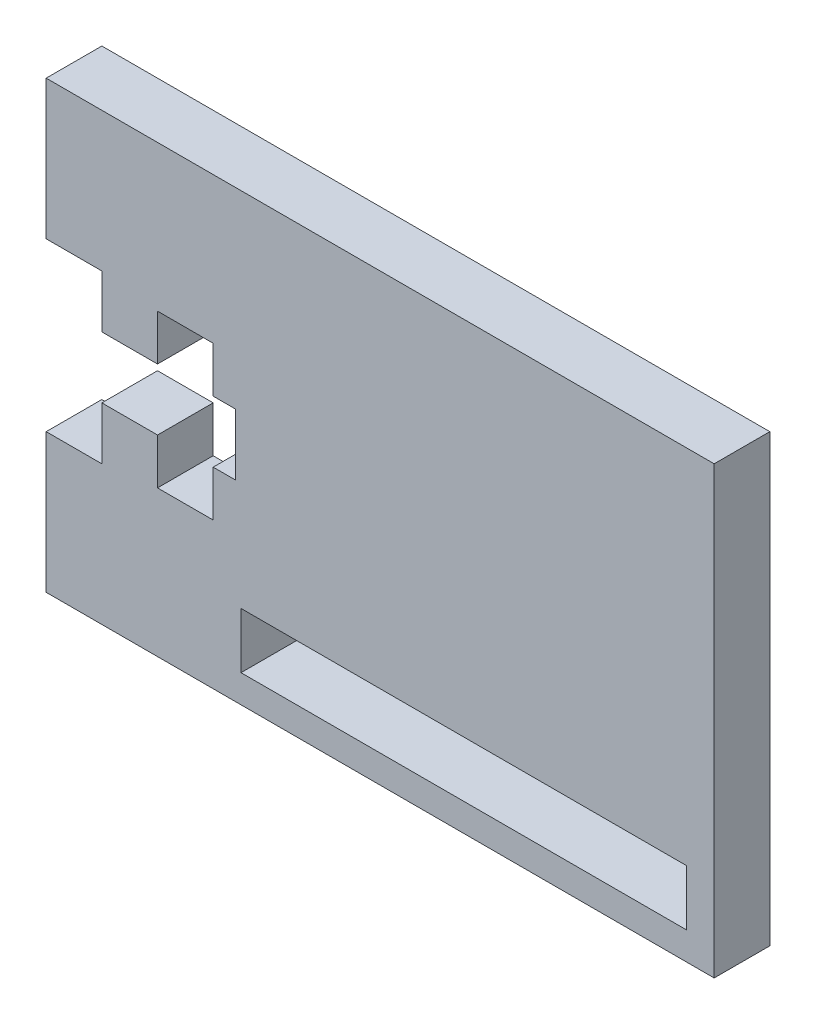
ISO-10303-21;
HEADER;
FILE_DESCRIPTION(('STEP AP214'),'2;1');
FILE_NAME('part.step','',(''),(''),'','','');
FILE_SCHEMA(('AUTOMOTIVE_DESIGN { 1 0 10303 214 1 1 1 1 }'));
ENDSEC;
DATA;
#1=APPLICATION_CONTEXT('core data for automotive mechanical design processes');
#2=APPLICATION_PROTOCOL_DEFINITION('international standard','automotive_design',2000,#1);
#3=PRODUCT_CONTEXT('',#1,'mechanical');
#4=PRODUCT('Part','Part','',(#3));
#5=PRODUCT_RELATED_PRODUCT_CATEGORY('part','',(#4));
#6=PRODUCT_DEFINITION_FORMATION('','',#4);
#7=PRODUCT_DEFINITION_CONTEXT('part definition',#1,'design');
#8=PRODUCT_DEFINITION('design','',#6,#7);
#9=PRODUCT_DEFINITION_SHAPE('','',#8);
#10=(LENGTH_UNIT() NAMED_UNIT(*) SI_UNIT(.MILLI.,.METRE.));
#11=(NAMED_UNIT(*) PLANE_ANGLE_UNIT() SI_UNIT($,.RADIAN.));
#12=(NAMED_UNIT(*) SI_UNIT($,.STERADIAN.) SOLID_ANGLE_UNIT());
#13=UNCERTAINTY_MEASURE_WITH_UNIT(LENGTH_MEASURE(1.E-05),#10,'distance_accuracy_value','');
#14=(GEOMETRIC_REPRESENTATION_CONTEXT(3) GLOBAL_UNCERTAINTY_ASSIGNED_CONTEXT((#13)) GLOBAL_UNIT_ASSIGNED_CONTEXT((#10,
#11,#12)) REPRESENTATION_CONTEXT('',''));
#15=CARTESIAN_POINT('',(0.,0.,0.));
#16=DIRECTION('',(0.,0.,1.));
#17=DIRECTION('',(1.,0.,0.));
#18=AXIS2_PLACEMENT_3D('',#15,#16,#17);
#19=CARTESIAN_POINT('',(0.,4.7625,3.175));
#20=DIRECTION('',(0.,1.,0.));
#21=DIRECTION('',(0.,0.,1.));
#22=AXIS2_PLACEMENT_3D('',#19,#20,#21);
#23=PLANE('',#22);
#24=DIRECTION('',(1.,0.,0.));
#25=VECTOR('',#24,1.);
#26=CARTESIAN_POINT('',(0.,4.7625,0.));
#27=LINE('',#26,#25);
#28=CARTESIAN_POINT('',(11.1125,4.7625,0.));
#29=VERTEX_POINT('',#28);
#30=CARTESIAN_POINT('',(36.5125,4.7625,0.));
#31=VERTEX_POINT('',#30);
#32=EDGE_CURVE('E274',#29,#31,#27,.T.);
#33=ORIENTED_EDGE('',*,*,#32,.T.);
#34=DIRECTION('',(0.,0.,-1.));
#35=VECTOR('',#34,1.);
#36=CARTESIAN_POINT('',(36.5125,4.7625,3.175));
#37=LINE('',#36,#35);
#38=CARTESIAN_POINT('',(36.5125,4.7625,3.175));
#39=VERTEX_POINT('',#38);
#40=EDGE_CURVE('E11',#39,#31,#37,.T.);
#41=ORIENTED_EDGE('',*,*,#40,.F.);
#42=DIRECTION('',(1.,0.,0.));
#43=VECTOR('',#42,1.);
#44=CARTESIAN_POINT('',(0.,4.7625,3.175));
#45=LINE('',#44,#43);
#46=CARTESIAN_POINT('',(11.1125,4.7625,3.175));
#47=VERTEX_POINT('',#46);
#48=EDGE_CURVE('E211',#47,#39,#45,.T.);
#49=ORIENTED_EDGE('',*,*,#48,.F.);
#50=DIRECTION('',(0.,0.,-1.));
#51=VECTOR('',#50,1.);
#52=CARTESIAN_POINT('',(11.1125,4.7625,3.175));
#53=LINE('',#52,#51);
#54=EDGE_CURVE('E54',#47,#29,#53,.T.);
#55=ORIENTED_EDGE('',*,*,#54,.T.);
#56=EDGE_LOOP('',(#33,#41,#49,#55));
#57=FACE_BOUND('',#56,.T.);
#58=ADVANCED_FACE('F35',(#57),#23,.F.);
#59=CARTESIAN_POINT('',(36.5125,0.,3.175));
#60=DIRECTION('',(1.,0.,0.));
#61=DIRECTION('',(0.,0.,-1.));
#62=AXIS2_PLACEMENT_3D('',#59,#60,#61);
#63=PLANE('',#62);
#64=DIRECTION('',(0.,-1.,0.));
#65=VECTOR('',#64,1.);
#66=CARTESIAN_POINT('',(36.5125,0.,0.));
#67=LINE('',#66,#65);
#68=CARTESIAN_POINT('',(36.5125,1.5875,0.));
#69=VERTEX_POINT('',#68);
#70=EDGE_CURVE('E217',#31,#69,#67,.T.);
#71=ORIENTED_EDGE('',*,*,#70,.T.);
#72=DIRECTION('',(0.,0.,-1.));
#73=VECTOR('',#72,1.);
#74=CARTESIAN_POINT('',(36.5125,1.5875,3.175));
#75=LINE('',#74,#73);
#76=CARTESIAN_POINT('',(36.5125,1.5875,3.175));
#77=VERTEX_POINT('',#76);
#78=EDGE_CURVE('E45',#77,#69,#75,.T.);
#79=ORIENTED_EDGE('',*,*,#78,.F.);
#80=DIRECTION('',(0.,-1.,0.));
#81=VECTOR('',#80,1.);
#82=CARTESIAN_POINT('',(36.5125,0.,3.175));
#83=LINE('',#82,#81);
#84=EDGE_CURVE('E205',#39,#77,#83,.T.);
#85=ORIENTED_EDGE('',*,*,#84,.F.);
#86=ORIENTED_EDGE('',*,*,#40,.T.);
#87=EDGE_LOOP('',(#71,#79,#85,#86));
#88=FACE_BOUND('',#87,.T.);
#89=ADVANCED_FACE('F216',(#88),#63,.F.);
#90=CARTESIAN_POINT('',(0.,1.5875,3.175));
#91=DIRECTION('',(0.,1.,0.));
#92=DIRECTION('',(0.,0.,1.));
#93=AXIS2_PLACEMENT_3D('',#90,#91,#92);
#94=PLANE('',#93);
#95=DIRECTION('',(1.,0.,0.));
#96=VECTOR('',#95,1.);
#97=CARTESIAN_POINT('',(0.,1.5875,0.));
#98=LINE('',#97,#96);
#99=CARTESIAN_POINT('',(11.1125,1.5875,0.));
#100=VERTEX_POINT('',#99);
#101=EDGE_CURVE('E277',#100,#69,#98,.T.);
#102=ORIENTED_EDGE('',*,*,#101,.F.);
#103=DIRECTION('',(0.,0.,-1.));
#104=VECTOR('',#103,1.);
#105=CARTESIAN_POINT('',(11.1125,1.5875,3.175));
#106=LINE('',#105,#104);
#107=CARTESIAN_POINT('',(11.1125,1.5875,3.175));
#108=VERTEX_POINT('',#107);
#109=EDGE_CURVE('E128',#108,#100,#106,.T.);
#110=ORIENTED_EDGE('',*,*,#109,.F.);
#111=DIRECTION('',(1.,0.,0.));
#112=VECTOR('',#111,1.);
#113=CARTESIAN_POINT('',(0.,1.5875,3.175));
#114=LINE('',#113,#112);
#115=EDGE_CURVE('E210',#108,#77,#114,.T.);
#116=ORIENTED_EDGE('',*,*,#115,.T.);
#117=ORIENTED_EDGE('',*,*,#78,.T.);
#118=EDGE_LOOP('',(#102,#110,#116,#117));
#119=FACE_BOUND('',#118,.T.);
#120=ADVANCED_FACE('F221',(#119),#94,.T.);
#121=CARTESIAN_POINT('',(3.175,0.,3.175));
#122=DIRECTION('',(1.,0.,0.));
#123=DIRECTION('',(0.,0.,-1.));
#124=AXIS2_PLACEMENT_3D('',#121,#122,#123);
#125=PLANE('',#124);
#126=DIRECTION('',(0.,-1.,0.));
#127=VECTOR('',#126,1.);
#128=CARTESIAN_POINT('',(3.175,0.,0.));
#129=LINE('',#128,#127);
#130=CARTESIAN_POINT('',(3.175,10.9474,0.));
#131=VERTEX_POINT('',#130);
#132=CARTESIAN_POINT('',(3.175,7.9375,0.));
#133=VERTEX_POINT('',#132);
#134=EDGE_CURVE('E228',#131,#133,#129,.T.);
#135=ORIENTED_EDGE('',*,*,#134,.T.);
#136=DIRECTION('',(0.,0.,-1.));
#137=VECTOR('',#136,1.);
#138=CARTESIAN_POINT('',(3.175,7.9375,3.175));
#139=LINE('',#138,#137);
#140=CARTESIAN_POINT('',(3.175,7.9375,3.175));
#141=VERTEX_POINT('',#140);
#142=EDGE_CURVE('E39',#141,#133,#139,.T.);
#143=ORIENTED_EDGE('',*,*,#142,.F.);
#144=DIRECTION('',(0.,-1.,0.));
#145=VECTOR('',#144,1.);
#146=CARTESIAN_POINT('',(3.175,0.,3.175));
#147=LINE('',#146,#145);
#148=CARTESIAN_POINT('',(3.175,10.9474,3.175));
#149=VERTEX_POINT('',#148);
#150=EDGE_CURVE('E282',#149,#141,#147,.T.);
#151=ORIENTED_EDGE('',*,*,#150,.F.);
#152=DIRECTION('',(0.,0.,-1.));
#153=VECTOR('',#152,1.);
#154=CARTESIAN_POINT('',(3.175,10.9474,3.175));
#155=LINE('',#154,#153);
#156=EDGE_CURVE('E224',#149,#131,#155,.T.);
#157=ORIENTED_EDGE('',*,*,#156,.T.);
#158=EDGE_LOOP('',(#135,#143,#151,#157));
#159=FACE_BOUND('',#158,.T.);
#160=ADVANCED_FACE('F37',(#159),#125,.F.);
#161=CARTESIAN_POINT('',(0.,7.9375,3.175));
#162=DIRECTION('',(0.,-1.,0.));
#163=DIRECTION('',(0.,0.,-1.));
#164=AXIS2_PLACEMENT_3D('',#161,#162,#163);
#165=PLANE('',#164);
#166=DIRECTION('',(-1.,0.,0.));
#167=VECTOR('',#166,1.);
#168=CARTESIAN_POINT('',(0.,7.9375,0.));
#169=LINE('',#168,#167);
#170=CARTESIAN_POINT('',(0.,7.9375,0.));
#171=VERTEX_POINT('',#170);
#172=EDGE_CURVE('E231',#133,#171,#169,.T.);
#173=ORIENTED_EDGE('',*,*,#172,.T.);
#174=DIRECTION('',(0.,0.,-1.));
#175=VECTOR('',#174,1.);
#176=CARTESIAN_POINT('',(0.,7.9375,3.175));
#177=LINE('',#176,#175);
#178=CARTESIAN_POINT('',(0.,7.9375,3.175));
#179=VERTEX_POINT('',#178);
#180=EDGE_CURVE('E331',#179,#171,#177,.T.);
#181=ORIENTED_EDGE('',*,*,#180,.F.);
#182=DIRECTION('',(-1.,0.,0.));
#183=VECTOR('',#182,1.);
#184=CARTESIAN_POINT('',(0.,7.9375,3.175));
#185=LINE('',#184,#183);
#186=EDGE_CURVE('E141',#141,#179,#185,.T.);
#187=ORIENTED_EDGE('',*,*,#186,.F.);
#188=ORIENTED_EDGE('',*,*,#142,.T.);
#189=EDGE_LOOP('',(#173,#181,#187,#188));
#190=FACE_BOUND('',#189,.T.);
#191=ADVANCED_FACE('F336',(#190),#165,.F.);
#192=CARTESIAN_POINT('',(0.,0.,3.175));
#193=DIRECTION('',(-1.,0.,0.));
#194=DIRECTION('',(0.,0.,1.));
#195=AXIS2_PLACEMENT_3D('',#192,#193,#194);
#196=PLANE('',#195);
#197=DIRECTION('',(0.,1.,0.));
#198=VECTOR('',#197,1.);
#199=CARTESIAN_POINT('',(0.,0.,0.));
#200=LINE('',#199,#198);
#201=CARTESIAN_POINT('',(0.,0.,0.));
#202=VERTEX_POINT('',#201);
#203=EDGE_CURVE('E234',#202,#171,#200,.T.);
#204=ORIENTED_EDGE('',*,*,#203,.F.);
#205=DIRECTION('',(0.,0.,-1.));
#206=VECTOR('',#205,1.);
#207=CARTESIAN_POINT('',(0.,0.,3.175));
#208=LINE('',#207,#206);
#209=CARTESIAN_POINT('',(0.,0.,3.175));
#210=VERTEX_POINT('',#209);
#211=EDGE_CURVE('E330',#210,#202,#208,.T.);
#212=ORIENTED_EDGE('',*,*,#211,.F.);
#213=DIRECTION('',(0.,1.,0.));
#214=VECTOR('',#213,1.);
#215=CARTESIAN_POINT('',(0.,0.,3.175));
#216=LINE('',#215,#214);
#217=EDGE_CURVE('E351',#210,#179,#216,.T.);
#218=ORIENTED_EDGE('',*,*,#217,.T.);
#219=ORIENTED_EDGE('',*,*,#180,.T.);
#220=EDGE_LOOP('',(#204,#212,#218,#219));
#221=FACE_BOUND('',#220,.T.);
#222=ADVANCED_FACE('F348',(#221),#196,.T.);
#223=CARTESIAN_POINT('',(0.,0.,3.175));
#224=DIRECTION('',(0.,1.,0.));
#225=DIRECTION('',(0.,0.,1.));
#226=AXIS2_PLACEMENT_3D('',#223,#224,#225);
#227=PLANE('',#226);
#228=DIRECTION('',(1.,0.,0.));
#229=VECTOR('',#228,1.);
#230=CARTESIAN_POINT('',(0.,0.,0.));
#231=LINE('',#230,#229);
#232=CARTESIAN_POINT('',(38.1,0.,0.));
#233=VERTEX_POINT('',#232);
#234=EDGE_CURVE('E237',#202,#233,#231,.T.);
#235=ORIENTED_EDGE('',*,*,#234,.T.);
#236=DIRECTION('',(0.,0.,-1.));
#237=VECTOR('',#236,1.);
#238=CARTESIAN_POINT('',(38.1,0.,3.175));
#239=LINE('',#238,#237);
#240=CARTESIAN_POINT('',(38.1,0.,3.175));
#241=VERTEX_POINT('',#240);
#242=EDGE_CURVE('E327',#241,#233,#239,.T.);
#243=ORIENTED_EDGE('',*,*,#242,.F.);
#244=DIRECTION('',(1.,0.,0.));
#245=VECTOR('',#244,1.);
#246=CARTESIAN_POINT('',(0.,0.,3.175));
#247=LINE('',#246,#245);
#248=EDGE_CURVE('E354',#210,#241,#247,.T.);
#249=ORIENTED_EDGE('',*,*,#248,.F.);
#250=ORIENTED_EDGE('',*,*,#211,.T.);
#251=EDGE_LOOP('',(#235,#243,#249,#250));
#252=FACE_BOUND('',#251,.T.);
#253=ADVANCED_FACE('F355',(#252),#227,.F.);
#254=CARTESIAN_POINT('',(38.1,0.,3.175));
#255=DIRECTION('',(-1.,0.,0.));
#256=DIRECTION('',(0.,0.,1.));
#257=AXIS2_PLACEMENT_3D('',#254,#255,#256);
#258=PLANE('',#257);
#259=DIRECTION('',(0.,1.,0.));
#260=VECTOR('',#259,1.);
#261=CARTESIAN_POINT('',(38.1,0.,0.));
#262=LINE('',#261,#260);
#263=CARTESIAN_POINT('',(38.1,25.4,0.));
#264=VERTEX_POINT('',#263);
#265=EDGE_CURVE('E240',#233,#264,#262,.T.);
#266=ORIENTED_EDGE('',*,*,#265,.T.);
#267=DIRECTION('',(0.,0.,-1.));
#268=VECTOR('',#267,1.);
#269=CARTESIAN_POINT('',(38.1,25.4,3.175));
#270=LINE('',#269,#268);
#271=CARTESIAN_POINT('',(38.1,25.4,3.175));
#272=VERTEX_POINT('',#271);
#273=EDGE_CURVE('E325',#272,#264,#270,.T.);
#274=ORIENTED_EDGE('',*,*,#273,.F.);
#275=DIRECTION('',(0.,1.,0.));
#276=VECTOR('',#275,1.);
#277=CARTESIAN_POINT('',(38.1,0.,3.175));
#278=LINE('',#277,#276);
#279=EDGE_CURVE('E358',#241,#272,#278,.T.);
#280=ORIENTED_EDGE('',*,*,#279,.F.);
#281=ORIENTED_EDGE('',*,*,#242,.T.);
#282=EDGE_LOOP('',(#266,#274,#280,#281));
#283=FACE_BOUND('',#282,.T.);
#284=ADVANCED_FACE('F468',(#283),#258,.F.);
#285=CARTESIAN_POINT('',(0.,25.4,3.175));
#286=DIRECTION('',(0.,1.,0.));
#287=DIRECTION('',(0.,0.,1.));
#288=AXIS2_PLACEMENT_3D('',#285,#286,#287);
#289=PLANE('',#288);
#290=DIRECTION('',(1.,0.,0.));
#291=VECTOR('',#290,1.);
#292=CARTESIAN_POINT('',(0.,25.4,0.));
#293=LINE('',#292,#291);
#294=CARTESIAN_POINT('',(0.,25.4,0.));
#295=VERTEX_POINT('',#294);
#296=EDGE_CURVE('E243',#295,#264,#293,.T.);
#297=ORIENTED_EDGE('',*,*,#296,.F.);
#298=DIRECTION('',(0.,0.,-1.));
#299=VECTOR('',#298,1.);
#300=CARTESIAN_POINT('',(0.,25.4,3.175));
#301=LINE('',#300,#299);
#302=CARTESIAN_POINT('',(0.,25.4,3.175));
#303=VERTEX_POINT('',#302);
#304=EDGE_CURVE('E323',#303,#295,#301,.T.);
#305=ORIENTED_EDGE('',*,*,#304,.F.);
#306=DIRECTION('',(1.,0.,0.));
#307=VECTOR('',#306,1.);
#308=CARTESIAN_POINT('',(0.,25.4,3.175));
#309=LINE('',#308,#307);
#310=EDGE_CURVE('E365',#303,#272,#309,.T.);
#311=ORIENTED_EDGE('',*,*,#310,.T.);
#312=ORIENTED_EDGE('',*,*,#273,.T.);
#313=EDGE_LOOP('',(#297,#305,#311,#312));
#314=FACE_BOUND('',#313,.T.);
#315=ADVANCED_FACE('F465',(#314),#289,.T.);
#316=CARTESIAN_POINT('',(0.,17.4625,0.));
#317=VERTEX_POINT('',#316);
#318=EDGE_CURVE('E238',#317,#295,#200,.T.);
#319=ORIENTED_EDGE('',*,*,#318,.F.);
#320=DIRECTION('',(0.,0.,-1.));
#321=VECTOR('',#320,1.);
#322=CARTESIAN_POINT('',(0.,17.4625,3.175));
#323=LINE('',#322,#321);
#324=CARTESIAN_POINT('',(0.,17.4625,3.175));
#325=VERTEX_POINT('',#324);
#326=EDGE_CURVE('E321',#325,#317,#323,.T.);
#327=ORIENTED_EDGE('',*,*,#326,.F.);
#328=EDGE_CURVE('E361',#325,#303,#216,.T.);
#329=ORIENTED_EDGE('',*,*,#328,.T.);
#330=ORIENTED_EDGE('',*,*,#304,.T.);
#331=EDGE_LOOP('',(#319,#327,#329,#330));
#332=FACE_BOUND('',#331,.T.);
#333=ADVANCED_FACE('F464',(#332),#196,.T.);
#334=CARTESIAN_POINT('',(0.,17.4625,3.175));
#335=DIRECTION('',(0.,-1.,0.));
#336=DIRECTION('',(0.,0.,-1.));
#337=AXIS2_PLACEMENT_3D('',#334,#335,#336);
#338=PLANE('',#337);
#339=DIRECTION('',(-1.,0.,0.));
#340=VECTOR('',#339,1.);
#341=CARTESIAN_POINT('',(0.,17.4625,0.));
#342=LINE('',#341,#340);
#343=CARTESIAN_POINT('',(3.175,17.4625,0.));
#344=VERTEX_POINT('',#343);
#345=EDGE_CURVE('E246',#344,#317,#342,.T.);
#346=ORIENTED_EDGE('',*,*,#345,.F.);
#347=DIRECTION('',(0.,0.,-1.));
#348=VECTOR('',#347,1.);
#349=CARTESIAN_POINT('',(3.175,17.4625,3.175));
#350=LINE('',#349,#348);
#351=CARTESIAN_POINT('',(3.175,17.4625,3.175));
#352=VERTEX_POINT('',#351);
#353=EDGE_CURVE('E319',#352,#344,#350,.T.);
#354=ORIENTED_EDGE('',*,*,#353,.F.);
#355=DIRECTION('',(-1.,0.,0.));
#356=VECTOR('',#355,1.);
#357=CARTESIAN_POINT('',(0.,17.4625,3.175));
#358=LINE('',#357,#356);
#359=EDGE_CURVE('E364',#352,#325,#358,.T.);
#360=ORIENTED_EDGE('',*,*,#359,.T.);
#361=ORIENTED_EDGE('',*,*,#326,.T.);
#362=EDGE_LOOP('',(#346,#354,#360,#361));
#363=FACE_BOUND('',#362,.T.);
#364=ADVANCED_FACE('F460',(#363),#338,.T.);
#365=CARTESIAN_POINT('',(3.175,0.,3.175));
#366=DIRECTION('',(-1.,0.,0.));
#367=DIRECTION('',(0.,0.,1.));
#368=AXIS2_PLACEMENT_3D('',#365,#366,#367);
#369=PLANE('',#368);
#370=DIRECTION('',(0.,1.,0.));
#371=VECTOR('',#370,1.);
#372=CARTESIAN_POINT('',(3.175,0.,0.));
#373=LINE('',#372,#371);
#374=CARTESIAN_POINT('',(3.175,14.4526,0.));
#375=VERTEX_POINT('',#374);
#376=EDGE_CURVE('E249',#375,#344,#373,.T.);
#377=ORIENTED_EDGE('',*,*,#376,.F.);
#378=DIRECTION('',(0.,0.,-1.));
#379=VECTOR('',#378,1.);
#380=CARTESIAN_POINT('',(3.175,14.4526,3.175));
#381=LINE('',#380,#379);
#382=CARTESIAN_POINT('',(3.175,14.4526,3.175));
#383=VERTEX_POINT('',#382);
#384=EDGE_CURVE('E317',#383,#375,#381,.T.);
#385=ORIENTED_EDGE('',*,*,#384,.F.);
#386=DIRECTION('',(0.,1.,0.));
#387=VECTOR('',#386,1.);
#388=CARTESIAN_POINT('',(3.175,0.,3.175));
#389=LINE('',#388,#387);
#390=EDGE_CURVE('E369',#383,#352,#389,.T.);
#391=ORIENTED_EDGE('',*,*,#390,.T.);
#392=ORIENTED_EDGE('',*,*,#353,.T.);
#393=EDGE_LOOP('',(#377,#385,#391,#392));
#394=FACE_BOUND('',#393,.T.);
#395=ADVANCED_FACE('F456',(#394),#369,.T.);
#396=CARTESIAN_POINT('',(0.,14.4526,3.175));
#397=DIRECTION('',(0.,1.,0.));
#398=DIRECTION('',(0.,0.,1.));
#399=AXIS2_PLACEMENT_3D('',#396,#397,#398);
#400=PLANE('',#399);
#401=DIRECTION('',(1.,0.,0.));
#402=VECTOR('',#401,1.);
#403=CARTESIAN_POINT('',(0.,14.4526,0.));
#404=LINE('',#403,#402);
#405=CARTESIAN_POINT('',(6.35,14.4526,0.));
#406=VERTEX_POINT('',#405);
#407=EDGE_CURVE('E252',#375,#406,#404,.T.);
#408=ORIENTED_EDGE('',*,*,#407,.T.);
#409=DIRECTION('',(0.,0.,-1.));
#410=VECTOR('',#409,1.);
#411=CARTESIAN_POINT('',(6.35,14.4526,3.175));
#412=LINE('',#411,#410);
#413=CARTESIAN_POINT('',(6.35,14.4526,3.175));
#414=VERTEX_POINT('',#413);
#415=EDGE_CURVE('E314',#414,#406,#412,.T.);
#416=ORIENTED_EDGE('',*,*,#415,.F.);
#417=DIRECTION('',(1.,0.,0.));
#418=VECTOR('',#417,1.);
#419=CARTESIAN_POINT('',(0.,14.4526,3.175));
#420=LINE('',#419,#418);
#421=EDGE_CURVE('E379',#383,#414,#420,.T.);
#422=ORIENTED_EDGE('',*,*,#421,.F.);
#423=ORIENTED_EDGE('',*,*,#384,.T.);
#424=EDGE_LOOP('',(#408,#416,#422,#423));
#425=FACE_BOUND('',#424,.T.);
#426=ADVANCED_FACE('F452',(#425),#400,.F.);
#427=CARTESIAN_POINT('',(6.34999999999999,0.,3.175));
#428=DIRECTION('',(-1.,0.,0.));
#429=DIRECTION('',(0.,-1.,0.));
#430=AXIS2_PLACEMENT_3D('',#427,#428,#429);
#431=PLANE('',#430);
#432=DIRECTION('',(0.,1.,0.));
#433=VECTOR('',#432,1.);
#434=CARTESIAN_POINT('',(6.34999999999999,0.,0.));
#435=LINE('',#434,#433);
#436=CARTESIAN_POINT('',(6.35,17.065625,0.));
#437=VERTEX_POINT('',#436);
#438=EDGE_CURVE('E254',#406,#437,#435,.T.);
#439=ORIENTED_EDGE('',*,*,#438,.T.);
#440=DIRECTION('',(0.,0.,-1.));
#441=VECTOR('',#440,1.);
#442=CARTESIAN_POINT('',(6.35,17.065625,3.175));
#443=LINE('',#442,#441);
#444=CARTESIAN_POINT('',(6.35,17.065625,3.175));
#445=VERTEX_POINT('',#444);
#446=EDGE_CURVE('E311',#445,#437,#443,.T.);
#447=ORIENTED_EDGE('',*,*,#446,.F.);
#448=DIRECTION('',(0.,1.,0.));
#449=VECTOR('',#448,1.);
#450=CARTESIAN_POINT('',(6.34999999999999,0.,3.175));
#451=LINE('',#450,#449);
#452=EDGE_CURVE('E381',#414,#445,#451,.T.);
#453=ORIENTED_EDGE('',*,*,#452,.F.);
#454=ORIENTED_EDGE('',*,*,#415,.T.);
#455=EDGE_LOOP('',(#439,#447,#453,#454));
#456=FACE_BOUND('',#455,.T.);
#457=ADVANCED_FACE('F448',(#456),#431,.F.);
#458=CARTESIAN_POINT('',(0.,17.065625,3.175));
#459=DIRECTION('',(0.,1.,0.));
#460=DIRECTION('',(0.,0.,1.));
#461=AXIS2_PLACEMENT_3D('',#458,#459,#460);
#462=PLANE('',#461);
#463=DIRECTION('',(1.,0.,0.));
#464=VECTOR('',#463,1.);
#465=CARTESIAN_POINT('',(0.,17.065625,0.));
#466=LINE('',#465,#464);
#467=CARTESIAN_POINT('',(9.525,17.065625,0.));
#468=VERTEX_POINT('',#467);
#469=EDGE_CURVE('E256',#437,#468,#466,.T.);
#470=ORIENTED_EDGE('',*,*,#469,.T.);
#471=DIRECTION('',(0.,0.,-1.));
#472=VECTOR('',#471,1.);
#473=CARTESIAN_POINT('',(9.525,17.065625,3.175));
#474=LINE('',#473,#472);
#475=CARTESIAN_POINT('',(9.525,17.065625,3.175));
#476=VERTEX_POINT('',#475);
#477=EDGE_CURVE('E308',#476,#468,#474,.T.);
#478=ORIENTED_EDGE('',*,*,#477,.F.);
#479=DIRECTION('',(1.,0.,0.));
#480=VECTOR('',#479,1.);
#481=CARTESIAN_POINT('',(0.,17.065625,3.175));
#482=LINE('',#481,#480);
#483=EDGE_CURVE('E383',#445,#476,#482,.T.);
#484=ORIENTED_EDGE('',*,*,#483,.F.);
#485=ORIENTED_EDGE('',*,*,#446,.T.);
#486=EDGE_LOOP('',(#470,#478,#484,#485));
#487=FACE_BOUND('',#486,.T.);
#488=ADVANCED_FACE('F443',(#487),#462,.F.);
#489=CARTESIAN_POINT('',(9.52500000000001,0.,3.175));
#490=DIRECTION('',(1.,0.,0.));
#491=DIRECTION('',(0.,1.,0.));
#492=AXIS2_PLACEMENT_3D('',#489,#490,#491);
#493=PLANE('',#492);
#494=DIRECTION('',(0.,-1.,0.));
#495=VECTOR('',#494,1.);
#496=CARTESIAN_POINT('',(9.52500000000001,0.,0.));
#497=LINE('',#496,#495);
#498=CARTESIAN_POINT('',(9.525,14.4526,0.));
#499=VERTEX_POINT('',#498);
#500=EDGE_CURVE('E258',#468,#499,#497,.T.);
#501=ORIENTED_EDGE('',*,*,#500,.T.);
#502=DIRECTION('',(0.,0.,-1.));
#503=VECTOR('',#502,1.);
#504=CARTESIAN_POINT('',(9.525,14.4526,3.175));
#505=LINE('',#504,#503);
#506=CARTESIAN_POINT('',(9.525,14.4526,3.175));
#507=VERTEX_POINT('',#506);
#508=EDGE_CURVE('E305',#507,#499,#505,.T.);
#509=ORIENTED_EDGE('',*,*,#508,.F.);
#510=DIRECTION('',(0.,-1.,0.));
#511=VECTOR('',#510,1.);
#512=CARTESIAN_POINT('',(9.52500000000001,0.,3.175));
#513=LINE('',#512,#511);
#514=EDGE_CURVE('E385',#476,#507,#513,.T.);
#515=ORIENTED_EDGE('',*,*,#514,.F.);
#516=ORIENTED_EDGE('',*,*,#477,.T.);
#517=EDGE_LOOP('',(#501,#509,#515,#516));
#518=FACE_BOUND('',#517,.T.);
#519=ADVANCED_FACE('F437',(#518),#493,.F.);
#520=CARTESIAN_POINT('',(0.,14.4526,3.175));
#521=DIRECTION('',(0.,1.,0.));
#522=DIRECTION('',(0.,0.,1.));
#523=AXIS2_PLACEMENT_3D('',#520,#521,#522);
#524=PLANE('',#523);
#525=DIRECTION('',(1.,0.,0.));
#526=VECTOR('',#525,1.);
#527=CARTESIAN_POINT('',(0.,14.4526,0.));
#528=LINE('',#527,#526);
#529=CARTESIAN_POINT('',(10.795,14.4526,0.));
#530=VERTEX_POINT('',#529);
#531=EDGE_CURVE('E260',#499,#530,#528,.T.);
#532=ORIENTED_EDGE('',*,*,#531,.T.);
#533=DIRECTION('',(0.,0.,-1.));
#534=VECTOR('',#533,1.);
#535=CARTESIAN_POINT('',(10.795,14.4526,3.175));
#536=LINE('',#535,#534);
#537=CARTESIAN_POINT('',(10.795,14.4526,3.175));
#538=VERTEX_POINT('',#537);
#539=EDGE_CURVE('E302',#538,#530,#536,.T.);
#540=ORIENTED_EDGE('',*,*,#539,.F.);
#541=DIRECTION('',(1.,0.,0.));
#542=VECTOR('',#541,1.);
#543=CARTESIAN_POINT('',(0.,14.4526,3.175));
#544=LINE('',#543,#542);
#545=EDGE_CURVE('E387',#507,#538,#544,.T.);
#546=ORIENTED_EDGE('',*,*,#545,.F.);
#547=ORIENTED_EDGE('',*,*,#508,.T.);
#548=EDGE_LOOP('',(#532,#540,#546,#547));
#549=FACE_BOUND('',#548,.T.);
#550=ADVANCED_FACE('F433',(#549),#524,.F.);
#551=CARTESIAN_POINT('',(10.795,0.,3.175));
#552=DIRECTION('',(1.,0.,0.));
#553=DIRECTION('',(0.,0.,-1.));
#554=AXIS2_PLACEMENT_3D('',#551,#552,#553);
#555=PLANE('',#554);
#556=DIRECTION('',(0.,-1.,0.));
#557=VECTOR('',#556,1.);
#558=CARTESIAN_POINT('',(10.795,0.,0.));
#559=LINE('',#558,#557);
#560=CARTESIAN_POINT('',(10.795,10.9474,0.));
#561=VERTEX_POINT('',#560);
#562=EDGE_CURVE('E262',#530,#561,#559,.T.);
#563=ORIENTED_EDGE('',*,*,#562,.T.);
#564=DIRECTION('',(0.,0.,-1.));
#565=VECTOR('',#564,1.);
#566=CARTESIAN_POINT('',(10.795,10.9474,3.175));
#567=LINE('',#566,#565);
#568=CARTESIAN_POINT('',(10.795,10.9474,3.175));
#569=VERTEX_POINT('',#568);
#570=EDGE_CURVE('E299',#569,#561,#567,.T.);
#571=ORIENTED_EDGE('',*,*,#570,.F.);
#572=DIRECTION('',(0.,-1.,0.));
#573=VECTOR('',#572,1.);
#574=CARTESIAN_POINT('',(10.795,0.,3.175));
#575=LINE('',#574,#573);
#576=EDGE_CURVE('E389',#538,#569,#575,.T.);
#577=ORIENTED_EDGE('',*,*,#576,.F.);
#578=ORIENTED_EDGE('',*,*,#539,.T.);
#579=EDGE_LOOP('',(#563,#571,#577,#578));
#580=FACE_BOUND('',#579,.T.);
#581=ADVANCED_FACE('F428',(#580),#555,.F.);
#582=CARTESIAN_POINT('',(0.,10.9474,3.175));
#583=DIRECTION('',(0.,-1.,0.));
#584=DIRECTION('',(0.,0.,-1.));
#585=AXIS2_PLACEMENT_3D('',#582,#583,#584);
#586=PLANE('',#585);
#587=DIRECTION('',(-1.,0.,0.));
#588=VECTOR('',#587,1.);
#589=CARTESIAN_POINT('',(0.,10.9474,0.));
#590=LINE('',#589,#588);
#591=CARTESIAN_POINT('',(9.525,10.9474,0.));
#592=VERTEX_POINT('',#591);
#593=EDGE_CURVE('E264',#561,#592,#590,.T.);
#594=ORIENTED_EDGE('',*,*,#593,.T.);
#595=DIRECTION('',(0.,0.,-1.));
#596=VECTOR('',#595,1.);
#597=CARTESIAN_POINT('',(9.525,10.9474,3.175));
#598=LINE('',#597,#596);
#599=CARTESIAN_POINT('',(9.525,10.9474,3.175));
#600=VERTEX_POINT('',#599);
#601=EDGE_CURVE('E296',#600,#592,#598,.T.);
#602=ORIENTED_EDGE('',*,*,#601,.F.);
#603=DIRECTION('',(-1.,0.,0.));
#604=VECTOR('',#603,1.);
#605=CARTESIAN_POINT('',(0.,10.9474,3.175));
#606=LINE('',#605,#604);
#607=EDGE_CURVE('E391',#569,#600,#606,.T.);
#608=ORIENTED_EDGE('',*,*,#607,.F.);
#609=ORIENTED_EDGE('',*,*,#570,.T.);
#610=EDGE_LOOP('',(#594,#602,#608,#609));
#611=FACE_BOUND('',#610,.T.);
#612=ADVANCED_FACE('F422',(#611),#586,.F.);
#613=CARTESIAN_POINT('',(9.52499999999999,0.,3.175));
#614=DIRECTION('',(1.,0.,0.));
#615=DIRECTION('',(0.,1.,0.));
#616=AXIS2_PLACEMENT_3D('',#613,#614,#615);
#617=PLANE('',#616);
#618=DIRECTION('',(0.,-1.,0.));
#619=VECTOR('',#618,1.);
#620=CARTESIAN_POINT('',(9.52499999999999,0.,0.));
#621=LINE('',#620,#619);
#622=CARTESIAN_POINT('',(9.525,8.334375,0.));
#623=VERTEX_POINT('',#622);
#624=EDGE_CURVE('E266',#592,#623,#621,.T.);
#625=ORIENTED_EDGE('',*,*,#624,.T.);
#626=DIRECTION('',(0.,0.,-1.));
#627=VECTOR('',#626,1.);
#628=CARTESIAN_POINT('',(9.525,8.334375,3.175));
#629=LINE('',#628,#627);
#630=CARTESIAN_POINT('',(9.525,8.334375,3.175));
#631=VERTEX_POINT('',#630);
#632=EDGE_CURVE('E293',#631,#623,#629,.T.);
#633=ORIENTED_EDGE('',*,*,#632,.F.);
#634=DIRECTION('',(0.,-1.,0.));
#635=VECTOR('',#634,1.);
#636=CARTESIAN_POINT('',(9.52499999999999,0.,3.175));
#637=LINE('',#636,#635);
#638=EDGE_CURVE('E393',#600,#631,#637,.T.);
#639=ORIENTED_EDGE('',*,*,#638,.F.);
#640=ORIENTED_EDGE('',*,*,#601,.T.);
#641=EDGE_LOOP('',(#625,#633,#639,#640));
#642=FACE_BOUND('',#641,.T.);
#643=ADVANCED_FACE('F418',(#642),#617,.F.);
#644=CARTESIAN_POINT('',(0.,8.33437499999999,3.175));
#645=DIRECTION('',(0.,-1.,0.));
#646=DIRECTION('',(1.,0.,0.));
#647=AXIS2_PLACEMENT_3D('',#644,#645,#646);
#648=PLANE('',#647);
#649=DIRECTION('',(-1.,0.,0.));
#650=VECTOR('',#649,1.);
#651=CARTESIAN_POINT('',(0.,8.33437499999999,0.));
#652=LINE('',#651,#650);
#653=CARTESIAN_POINT('',(6.35,8.334375,0.));
#654=VERTEX_POINT('',#653);
#655=EDGE_CURVE('E268',#623,#654,#652,.T.);
#656=ORIENTED_EDGE('',*,*,#655,.T.);
#657=DIRECTION('',(0.,0.,-1.));
#658=VECTOR('',#657,1.);
#659=CARTESIAN_POINT('',(6.35,8.334375,3.175));
#660=LINE('',#659,#658);
#661=CARTESIAN_POINT('',(6.35,8.334375,3.175));
#662=VERTEX_POINT('',#661);
#663=EDGE_CURVE('E290',#662,#654,#660,.T.);
#664=ORIENTED_EDGE('',*,*,#663,.F.);
#665=DIRECTION('',(-1.,0.,0.));
#666=VECTOR('',#665,1.);
#667=CARTESIAN_POINT('',(0.,8.33437499999999,3.175));
#668=LINE('',#667,#666);
#669=EDGE_CURVE('E395',#631,#662,#668,.T.);
#670=ORIENTED_EDGE('',*,*,#669,.F.);
#671=ORIENTED_EDGE('',*,*,#632,.T.);
#672=EDGE_LOOP('',(#656,#664,#670,#671));
#673=FACE_BOUND('',#672,.T.);
#674=ADVANCED_FACE('F413',(#673),#648,.F.);
#675=CARTESIAN_POINT('',(6.35,0.,3.175));
#676=DIRECTION('',(-1.,0.,0.));
#677=DIRECTION('',(0.,-1.,0.));
#678=AXIS2_PLACEMENT_3D('',#675,#676,#677);
#679=PLANE('',#678);
#680=DIRECTION('',(0.,1.,0.));
#681=VECTOR('',#680,1.);
#682=CARTESIAN_POINT('',(6.35,0.,0.));
#683=LINE('',#682,#681);
#684=CARTESIAN_POINT('',(6.35,10.9474,0.));
#685=VERTEX_POINT('',#684);
#686=EDGE_CURVE('E270',#654,#685,#683,.T.);
#687=ORIENTED_EDGE('',*,*,#686,.T.);
#688=DIRECTION('',(0.,0.,-1.));
#689=VECTOR('',#688,1.);
#690=CARTESIAN_POINT('',(6.35,10.9474,3.175));
#691=LINE('',#690,#689);
#692=CARTESIAN_POINT('',(6.35,10.9474,3.175));
#693=VERTEX_POINT('',#692);
#694=EDGE_CURVE('E287',#693,#685,#691,.T.);
#695=ORIENTED_EDGE('',*,*,#694,.F.);
#696=DIRECTION('',(0.,1.,0.));
#697=VECTOR('',#696,1.);
#698=CARTESIAN_POINT('',(6.35,0.,3.175));
#699=LINE('',#698,#697);
#700=EDGE_CURVE('E397',#662,#693,#699,.T.);
#701=ORIENTED_EDGE('',*,*,#700,.F.);
#702=ORIENTED_EDGE('',*,*,#663,.T.);
#703=EDGE_LOOP('',(#687,#695,#701,#702));
#704=FACE_BOUND('',#703,.T.);
#705=ADVANCED_FACE('F407',(#704),#679,.F.);
#706=CARTESIAN_POINT('',(0.,10.9474,3.175));
#707=DIRECTION('',(0.,-1.,0.));
#708=DIRECTION('',(0.,0.,-1.));
#709=AXIS2_PLACEMENT_3D('',#706,#707,#708);
#710=PLANE('',#709);
#711=DIRECTION('',(-1.,0.,0.));
#712=VECTOR('',#711,1.);
#713=CARTESIAN_POINT('',(0.,10.9474,0.));
#714=LINE('',#713,#712);
#715=EDGE_CURVE('E272',#685,#131,#714,.T.);
#716=ORIENTED_EDGE('',*,*,#715,.T.);
#717=ORIENTED_EDGE('',*,*,#156,.F.);
#718=DIRECTION('',(-1.,0.,0.));
#719=VECTOR('',#718,1.);
#720=CARTESIAN_POINT('',(0.,10.9474,3.175));
#721=LINE('',#720,#719);
#722=EDGE_CURVE('E399',#693,#149,#721,.T.);
#723=ORIENTED_EDGE('',*,*,#722,.F.);
#724=ORIENTED_EDGE('',*,*,#694,.T.);
#725=EDGE_LOOP('',(#716,#717,#723,#724));
#726=FACE_BOUND('',#725,.T.);
#727=ADVANCED_FACE('F404',(#726),#710,.F.);
#728=CARTESIAN_POINT('',(11.1125,0.,3.175));
#729=DIRECTION('',(1.,0.,0.));
#730=DIRECTION('',(0.,0.,-1.));
#731=AXIS2_PLACEMENT_3D('',#728,#729,#730);
#732=PLANE('',#731);
#733=DIRECTION('',(0.,-1.,0.));
#734=VECTOR('',#733,1.);
#735=CARTESIAN_POINT('',(11.1125,0.,0.));
#736=LINE('',#735,#734);
#737=EDGE_CURVE('E279',#29,#100,#736,.T.);
#738=ORIENTED_EDGE('',*,*,#737,.F.);
#739=ORIENTED_EDGE('',*,*,#54,.F.);
#740=DIRECTION('',(0.,-1.,0.));
#741=VECTOR('',#740,1.);
#742=CARTESIAN_POINT('',(11.1125,0.,3.175));
#743=LINE('',#742,#741);
#744=EDGE_CURVE('E222',#47,#108,#743,.T.);
#745=ORIENTED_EDGE('',*,*,#744,.T.);
#746=ORIENTED_EDGE('',*,*,#109,.T.);
#747=EDGE_LOOP('',(#738,#739,#745,#746));
#748=FACE_BOUND('',#747,.T.);
#749=ADVANCED_FACE('F487',(#748),#732,.T.);
#750=CARTESIAN_POINT('',(0.,0.,3.175));
#751=DIRECTION('',(0.,0.,1.));
#752=DIRECTION('',(1.,0.,0.));
#753=AXIS2_PLACEMENT_3D('',#750,#751,#752);
#754=PLANE('',#753);
#755=ORIENTED_EDGE('',*,*,#150,.T.);
#756=ORIENTED_EDGE('',*,*,#186,.T.);
#757=ORIENTED_EDGE('',*,*,#217,.F.);
#758=ORIENTED_EDGE('',*,*,#248,.T.);
#759=ORIENTED_EDGE('',*,*,#279,.T.);
#760=ORIENTED_EDGE('',*,*,#310,.F.);
#761=ORIENTED_EDGE('',*,*,#328,.F.);
#762=ORIENTED_EDGE('',*,*,#359,.F.);
#763=ORIENTED_EDGE('',*,*,#390,.F.);
#764=ORIENTED_EDGE('',*,*,#421,.T.);
#765=ORIENTED_EDGE('',*,*,#452,.T.);
#766=ORIENTED_EDGE('',*,*,#483,.T.);
#767=ORIENTED_EDGE('',*,*,#514,.T.);
#768=ORIENTED_EDGE('',*,*,#545,.T.);
#769=ORIENTED_EDGE('',*,*,#576,.T.);
#770=ORIENTED_EDGE('',*,*,#607,.T.);
#771=ORIENTED_EDGE('',*,*,#638,.T.);
#772=ORIENTED_EDGE('',*,*,#669,.T.);
#773=ORIENTED_EDGE('',*,*,#700,.T.);
#774=ORIENTED_EDGE('',*,*,#722,.T.);
#775=EDGE_LOOP('',(#755,#756,#757,#758,#759,#760,#761,#762,#763,#764,#765,#766,#767,#768,#769,
#770,#771,#772,#773,#774));
#776=FACE_BOUND('',#775,.T.);
#777=ORIENTED_EDGE('',*,*,#48,.T.);
#778=ORIENTED_EDGE('',*,*,#84,.T.);
#779=ORIENTED_EDGE('',*,*,#115,.F.);
#780=ORIENTED_EDGE('',*,*,#744,.F.);
#781=EDGE_LOOP('',(#777,#778,#779,#780));
#782=FACE_BOUND('',#781,.T.);
#783=ADVANCED_FACE('F207',(#776,#782),#754,.T.);
#784=CARTESIAN_POINT('',(0.,0.,0.));
#785=DIRECTION('',(0.,0.,1.));
#786=DIRECTION('',(1.,0.,0.));
#787=AXIS2_PLACEMENT_3D('',#784,#785,#786);
#788=PLANE('',#787);
#789=ORIENTED_EDGE('',*,*,#134,.F.);
#790=ORIENTED_EDGE('',*,*,#715,.F.);
#791=ORIENTED_EDGE('',*,*,#686,.F.);
#792=ORIENTED_EDGE('',*,*,#655,.F.);
#793=ORIENTED_EDGE('',*,*,#624,.F.);
#794=ORIENTED_EDGE('',*,*,#593,.F.);
#795=ORIENTED_EDGE('',*,*,#562,.F.);
#796=ORIENTED_EDGE('',*,*,#531,.F.);
#797=ORIENTED_EDGE('',*,*,#500,.F.);
#798=ORIENTED_EDGE('',*,*,#469,.F.);
#799=ORIENTED_EDGE('',*,*,#438,.F.);
#800=ORIENTED_EDGE('',*,*,#407,.F.);
#801=ORIENTED_EDGE('',*,*,#376,.T.);
#802=ORIENTED_EDGE('',*,*,#345,.T.);
#803=ORIENTED_EDGE('',*,*,#318,.T.);
#804=ORIENTED_EDGE('',*,*,#296,.T.);
#805=ORIENTED_EDGE('',*,*,#265,.F.);
#806=ORIENTED_EDGE('',*,*,#234,.F.);
#807=ORIENTED_EDGE('',*,*,#203,.T.);
#808=ORIENTED_EDGE('',*,*,#172,.F.);
#809=EDGE_LOOP('',(#789,#790,#791,#792,#793,#794,#795,#796,#797,#798,#799,#800,#801,#802,#803,
#804,#805,#806,#807,#808));
#810=FACE_BOUND('',#809,.T.);
#811=ORIENTED_EDGE('',*,*,#32,.F.);
#812=ORIENTED_EDGE('',*,*,#737,.T.);
#813=ORIENTED_EDGE('',*,*,#101,.T.);
#814=ORIENTED_EDGE('',*,*,#70,.F.);
#815=EDGE_LOOP('',(#811,#812,#813,#814));
#816=FACE_BOUND('',#815,.T.);
#817=ADVANCED_FACE('F343',(#810,#816),#788,.F.);
#818=CLOSED_SHELL('',(#58,#89,#120,#160,#191,#222,#253,#284,#315,#333,#364,#395,#426,#457,#488,
#519,#550,#581,#612,#643,#674,#705,#727,#749,#783,#817));
#819=MANIFOLD_SOLID_BREP('B2',#818);
#820=ADVANCED_BREP_SHAPE_REPRESENTATION('',(#18,#819),#14);
#821=SHAPE_DEFINITION_REPRESENTATION(#9,#820);
ENDSEC;
END-ISO-10303-21;
